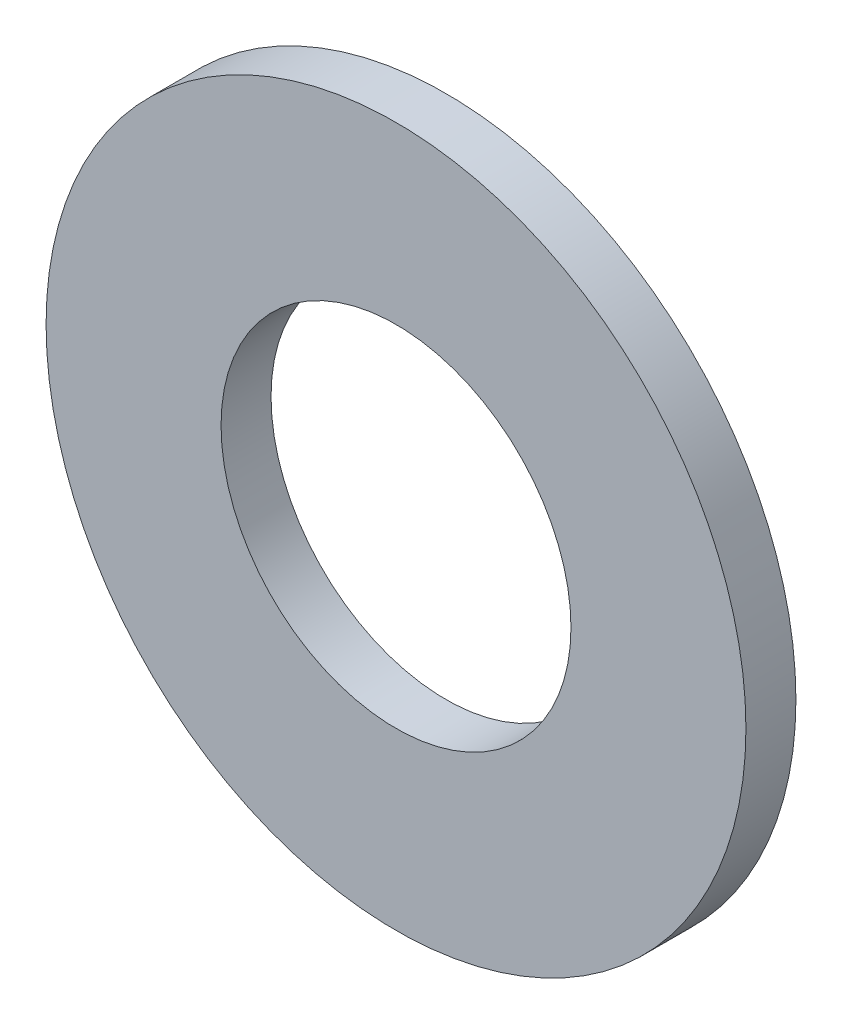
ISO-10303-21;
HEADER;
FILE_DESCRIPTION(('STEP AP214'),'2;1');
FILE_NAME('part.step','',(''),(''),'','','');
FILE_SCHEMA(('AUTOMOTIVE_DESIGN { 1 0 10303 214 1 1 1 1 }'));
ENDSEC;
DATA;
#1=APPLICATION_CONTEXT('core data for automotive mechanical design processes');
#2=APPLICATION_PROTOCOL_DEFINITION('international standard','automotive_design',2000,#1);
#3=PRODUCT_CONTEXT('',#1,'mechanical');
#4=PRODUCT('Part','Part','',(#3));
#5=PRODUCT_RELATED_PRODUCT_CATEGORY('part','',(#4));
#6=PRODUCT_DEFINITION_FORMATION('','',#4);
#7=PRODUCT_DEFINITION_CONTEXT('part definition',#1,'design');
#8=PRODUCT_DEFINITION('design','',#6,#7);
#9=PRODUCT_DEFINITION_SHAPE('','',#8);
#10=(LENGTH_UNIT() NAMED_UNIT(*) SI_UNIT(.MILLI.,.METRE.));
#11=(NAMED_UNIT(*) PLANE_ANGLE_UNIT() SI_UNIT($,.RADIAN.));
#12=(NAMED_UNIT(*) SI_UNIT($,.STERADIAN.) SOLID_ANGLE_UNIT());
#13=UNCERTAINTY_MEASURE_WITH_UNIT(LENGTH_MEASURE(1.E-05),#10,'distance_accuracy_value','');
#14=(GEOMETRIC_REPRESENTATION_CONTEXT(3) GLOBAL_UNCERTAINTY_ASSIGNED_CONTEXT((#13)) GLOBAL_UNIT_ASSIGNED_CONTEXT((#10,
#11,#12)) REPRESENTATION_CONTEXT('',''));
#15=CARTESIAN_POINT('',(0.,0.,0.));
#16=DIRECTION('',(0.,0.,1.));
#17=DIRECTION('',(1.,0.,0.));
#18=AXIS2_PLACEMENT_3D('',#15,#16,#17);
#19=CARTESIAN_POINT('',(0.,0.,0.5));
#20=DIRECTION('',(0.,0.,1.));
#21=DIRECTION('',(1.,0.,0.));
#22=AXIS2_PLACEMENT_3D('',#19,#20,#21);
#23=PLANE('',#22);
#24=CARTESIAN_POINT('',(0.,0.,0.5));
#25=DIRECTION('',(0.,0.,1.));
#26=DIRECTION('',(1.,0.,0.));
#27=AXIS2_PLACEMENT_3D('',#24,#25,#26);
#28=CIRCLE('',#27,3.5);
#29=CARTESIAN_POINT('',(3.5,0.,0.5));
#30=VERTEX_POINT('',#29);
#31=EDGE_CURVE('E10',#30,#30,#28,.T.);
#32=ORIENTED_EDGE('',*,*,#31,.T.);
#33=EDGE_LOOP('',(#32));
#34=FACE_BOUND('',#33,.T.);
#35=CARTESIAN_POINT('',(0.,0.,0.5));
#36=DIRECTION('',(0.,0.,1.));
#37=DIRECTION('',(1.,0.,0.));
#38=AXIS2_PLACEMENT_3D('',#35,#36,#37);
#39=CIRCLE('',#38,1.75);
#40=CARTESIAN_POINT('',(1.75,0.,0.5));
#41=VERTEX_POINT('',#40);
#42=EDGE_CURVE('E42',#41,#41,#39,.T.);
#43=ORIENTED_EDGE('',*,*,#42,.F.);
#44=EDGE_LOOP('',(#43));
#45=FACE_BOUND('',#44,.T.);
#46=ADVANCED_FACE('F31',(#34,#45),#23,.T.);
#47=CARTESIAN_POINT('',(0.,0.,0.));
#48=DIRECTION('',(0.,0.,1.));
#49=DIRECTION('',(1.,0.,0.));
#50=AXIS2_PLACEMENT_3D('',#47,#48,#49);
#51=PLANE('',#50);
#52=CARTESIAN_POINT('',(0.,0.,0.));
#53=DIRECTION('',(0.,0.,1.));
#54=DIRECTION('',(1.,0.,0.));
#55=AXIS2_PLACEMENT_3D('',#52,#53,#54);
#56=CIRCLE('',#55,3.5);
#57=CARTESIAN_POINT('',(3.5,0.,0.));
#58=VERTEX_POINT('',#57);
#59=EDGE_CURVE('E35',#58,#58,#56,.T.);
#60=ORIENTED_EDGE('',*,*,#59,.F.);
#61=EDGE_LOOP('',(#60));
#62=FACE_BOUND('',#61,.T.);
#63=CARTESIAN_POINT('',(0.,0.,0.));
#64=DIRECTION('',(0.,0.,1.));
#65=DIRECTION('',(1.,0.,0.));
#66=AXIS2_PLACEMENT_3D('',#63,#64,#65);
#67=CIRCLE('',#66,1.75);
#68=CARTESIAN_POINT('',(1.75,0.,0.));
#69=VERTEX_POINT('',#68);
#70=EDGE_CURVE('E44',#69,#69,#67,.T.);
#71=ORIENTED_EDGE('',*,*,#70,.T.);
#72=EDGE_LOOP('',(#71));
#73=FACE_BOUND('',#72,.T.);
#74=ADVANCED_FACE('F54',(#62,#73),#51,.F.);
#75=CARTESIAN_POINT('',(0.,0.,0.5));
#76=DIRECTION('',(0.,0.,-1.));
#77=DIRECTION('',(-1.,0.,0.));
#78=AXIS2_PLACEMENT_3D('',#75,#76,#77);
#79=CYLINDRICAL_SURFACE('',#78,3.5);
#80=ORIENTED_EDGE('',*,*,#31,.F.);
#81=EDGE_LOOP('',(#80));
#82=FACE_BOUND('',#81,.T.);
#83=ORIENTED_EDGE('',*,*,#59,.T.);
#84=EDGE_LOOP('',(#83));
#85=FACE_BOUND('',#84,.T.);
#86=ADVANCED_FACE('F33',(#82,#85),#79,.T.);
#87=CARTESIAN_POINT('',(0.,0.,0.5));
#88=DIRECTION('',(0.,0.,-1.));
#89=DIRECTION('',(-1.,0.,0.));
#90=AXIS2_PLACEMENT_3D('',#87,#88,#89);
#91=CYLINDRICAL_SURFACE('',#90,1.75);
#92=ORIENTED_EDGE('',*,*,#42,.T.);
#93=EDGE_LOOP('',(#92));
#94=FACE_BOUND('',#93,.T.);
#95=ORIENTED_EDGE('',*,*,#70,.F.);
#96=EDGE_LOOP('',(#95));
#97=FACE_BOUND('',#96,.T.);
#98=ADVANCED_FACE('F50',(#94,#97),#91,.F.);
#99=CLOSED_SHELL('',(#46,#74,#86,#98));
#100=MANIFOLD_SOLID_BREP('B2',#99);
#101=ADVANCED_BREP_SHAPE_REPRESENTATION('',(#18,#100),#14);
#102=SHAPE_DEFINITION_REPRESENTATION(#9,#101);
ENDSEC;
END-ISO-10303-21;
